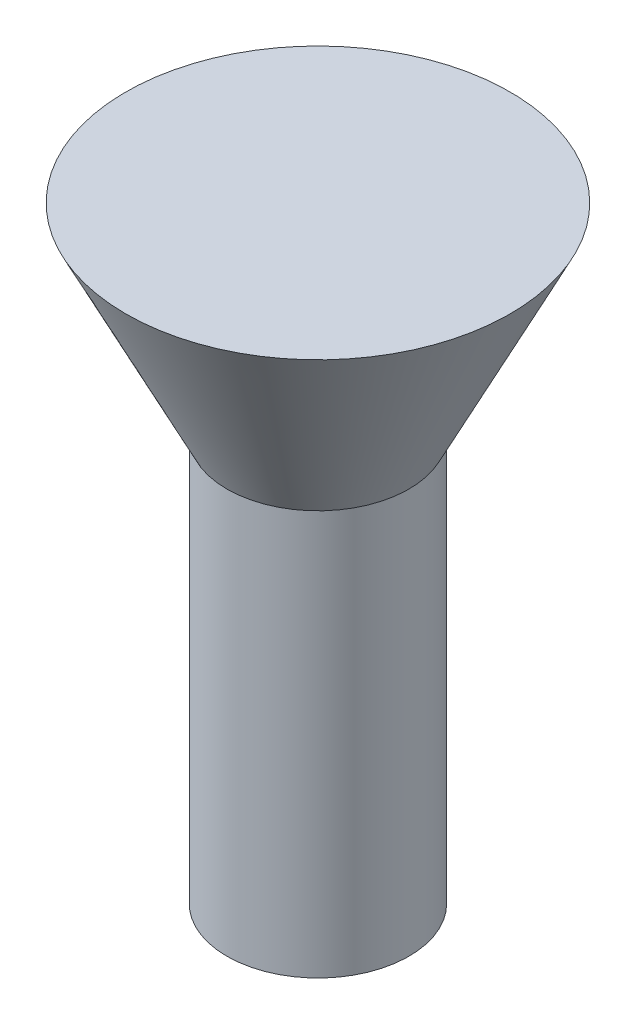
ISO-10303-21;
HEADER;
FILE_DESCRIPTION(('STEP AP214'),'2;1');
FILE_NAME('part.step','',(''),(''),'','','');
FILE_SCHEMA(('AUTOMOTIVE_DESIGN { 1 0 10303 214 1 1 1 1 }'));
ENDSEC;
DATA;
#1=APPLICATION_CONTEXT('core data for automotive mechanical design processes');
#2=APPLICATION_PROTOCOL_DEFINITION('international standard','automotive_design',2000,#1);
#3=PRODUCT_CONTEXT('',#1,'mechanical');
#4=PRODUCT('Part','Part','',(#3));
#5=PRODUCT_RELATED_PRODUCT_CATEGORY('part','',(#4));
#6=PRODUCT_DEFINITION_FORMATION('','',#4);
#7=PRODUCT_DEFINITION_CONTEXT('part definition',#1,'design');
#8=PRODUCT_DEFINITION('design','',#6,#7);
#9=PRODUCT_DEFINITION_SHAPE('','',#8);
#10=(LENGTH_UNIT() NAMED_UNIT(*) SI_UNIT(.MILLI.,.METRE.));
#11=(NAMED_UNIT(*) PLANE_ANGLE_UNIT() SI_UNIT($,.RADIAN.));
#12=(NAMED_UNIT(*) SI_UNIT($,.STERADIAN.) SOLID_ANGLE_UNIT());
#13=UNCERTAINTY_MEASURE_WITH_UNIT(LENGTH_MEASURE(1.E-05),#10,'distance_accuracy_value','');
#14=(GEOMETRIC_REPRESENTATION_CONTEXT(3) GLOBAL_UNCERTAINTY_ASSIGNED_CONTEXT((#13)) GLOBAL_UNIT_ASSIGNED_CONTEXT((#10,
#11,#12)) REPRESENTATION_CONTEXT('',''));
#15=CARTESIAN_POINT('',(0.,0.,0.));
#16=DIRECTION('',(0.,0.,1.));
#17=DIRECTION('',(1.,0.,0.));
#18=AXIS2_PLACEMENT_3D('',#15,#16,#17);
#19=CARTESIAN_POINT('',(0.,20.,0.));
#20=DIRECTION('',(0.,-1.,0.));
#21=DIRECTION('',(0.,0.,-1.));
#22=AXIS2_PLACEMENT_3D('',#19,#20,#21);
#23=CYLINDRICAL_SURFACE('',#22,4.5);
#24=CARTESIAN_POINT('',(0.,20.,0.));
#25=DIRECTION('',(0.,1.,0.));
#26=DIRECTION('',(0.,0.,1.));
#27=AXIS2_PLACEMENT_3D('',#24,#25,#26);
#28=CIRCLE('',#27,4.5);
#29=CARTESIAN_POINT('',(0.,20.,4.5));
#30=VERTEX_POINT('',#29);
#31=EDGE_CURVE('E11',#30,#30,#28,.T.);
#32=ORIENTED_EDGE('',*,*,#31,.F.);
#33=EDGE_LOOP('',(#32));
#34=FACE_BOUND('',#33,.T.);
#35=CARTESIAN_POINT('',(0.,0.,0.));
#36=DIRECTION('',(0.,1.,0.));
#37=DIRECTION('',(0.,0.,1.));
#38=AXIS2_PLACEMENT_3D('',#35,#36,#37);
#39=CIRCLE('',#38,4.5);
#40=CARTESIAN_POINT('',(0.,0.,4.5));
#41=VERTEX_POINT('',#40);
#42=EDGE_CURVE('E53',#41,#41,#39,.T.);
#43=ORIENTED_EDGE('',*,*,#42,.T.);
#44=EDGE_LOOP('',(#43));
#45=FACE_BOUND('',#44,.T.);
#46=ADVANCED_FACE('F45',(#34,#45),#23,.T.);
#47=CARTESIAN_POINT('',(0.,0.,0.));
#48=DIRECTION('',(0.,1.,0.));
#49=DIRECTION('',(0.,0.,1.));
#50=AXIS2_PLACEMENT_3D('',#47,#48,#49);
#51=PLANE('',#50);
#52=ORIENTED_EDGE('',*,*,#42,.F.);
#53=EDGE_LOOP('',(#52));
#54=FACE_BOUND('',#53,.T.);
#55=ADVANCED_FACE('F81',(#54),#51,.F.);
#56=CARTESIAN_POINT('',(0.,30.,0.));
#57=DIRECTION('',(0.,1.,0.));
#58=DIRECTION('',(0.,0.,1.));
#59=AXIS2_PLACEMENT_3D('',#56,#57,#58);
#60=PLANE('',#59);
#61=CARTESIAN_POINT('',(0.,30.,0.));
#62=DIRECTION('',(0.,1.,0.));
#63=DIRECTION('',(0.,0.,1.));
#64=AXIS2_PLACEMENT_3D('',#61,#62,#63);
#65=CIRCLE('',#64,9.5);
#66=CARTESIAN_POINT('',(0.,30.,9.5));
#67=VERTEX_POINT('',#66);
#68=EDGE_CURVE('E58',#67,#67,#65,.T.);
#69=ORIENTED_EDGE('',*,*,#68,.T.);
#70=EDGE_LOOP('',(#69));
#71=FACE_BOUND('',#70,.T.);
#72=ADVANCED_FACE('F71',(#71),#60,.T.);
#73=CARTESIAN_POINT('',(0.,20.,0.));
#74=DIRECTION('',(0.,1.,0.));
#75=DIRECTION('',(0.,0.,1.));
#76=AXIS2_PLACEMENT_3D('',#73,#74,#75);
#77=CONICAL_SURFACE('',#76,4.5,0.463647609000806);
#78=ORIENTED_EDGE('',*,*,#68,.F.);
#79=EDGE_LOOP('',(#78));
#80=FACE_BOUND('',#79,.T.);
#81=ORIENTED_EDGE('',*,*,#31,.T.);
#82=EDGE_LOOP('',(#81));
#83=FACE_BOUND('',#82,.T.);
#84=ADVANCED_FACE('F80',(#80,#83),#77,.T.);
#85=CLOSED_SHELL('',(#46,#55,#72,#84));
#86=MANIFOLD_SOLID_BREP('B2',#85);
#87=ADVANCED_BREP_SHAPE_REPRESENTATION('',(#18,#86),#14);
#88=SHAPE_DEFINITION_REPRESENTATION(#9,#87);
ENDSEC;
END-ISO-10303-21;
